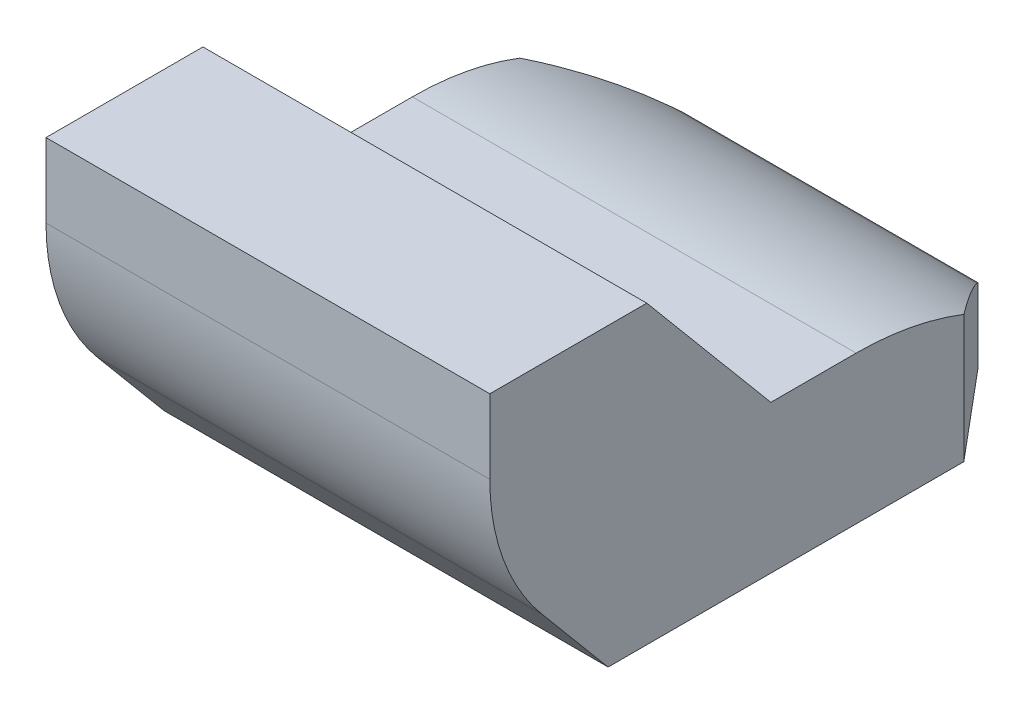
ISO-10303-21;
HEADER;
FILE_DESCRIPTION(('STEP AP214'),'2;1');
FILE_NAME('part.step','',(''),(''),'','','');
FILE_SCHEMA(('AUTOMOTIVE_DESIGN { 1 0 10303 214 1 1 1 1 }'));
ENDSEC;
DATA;
#1=APPLICATION_CONTEXT('core data for automotive mechanical design processes');
#2=APPLICATION_PROTOCOL_DEFINITION('international standard','automotive_design',2000,#1);
#3=PRODUCT_CONTEXT('',#1,'mechanical');
#4=PRODUCT('Part','Part','',(#3));
#5=PRODUCT_RELATED_PRODUCT_CATEGORY('part','',(#4));
#6=PRODUCT_DEFINITION_FORMATION('','',#4);
#7=PRODUCT_DEFINITION_CONTEXT('part definition',#1,'design');
#8=PRODUCT_DEFINITION('design','',#6,#7);
#9=PRODUCT_DEFINITION_SHAPE('','',#8);
#10=(LENGTH_UNIT() NAMED_UNIT(*) SI_UNIT(.MILLI.,.METRE.));
#11=(NAMED_UNIT(*) PLANE_ANGLE_UNIT() SI_UNIT($,.RADIAN.));
#12=(NAMED_UNIT(*) SI_UNIT($,.STERADIAN.) SOLID_ANGLE_UNIT());
#13=UNCERTAINTY_MEASURE_WITH_UNIT(LENGTH_MEASURE(1.E-05),#10,'distance_accuracy_value','');
#14=(GEOMETRIC_REPRESENTATION_CONTEXT(3) GLOBAL_UNCERTAINTY_ASSIGNED_CONTEXT((#13)) GLOBAL_UNIT_ASSIGNED_CONTEXT((#10,
#11,#12)) REPRESENTATION_CONTEXT('',''));
#15=CARTESIAN_POINT('',(0.,0.,0.));
#16=DIRECTION('',(0.,0.,1.));
#17=DIRECTION('',(1.,0.,0.));
#18=AXIS2_PLACEMENT_3D('',#15,#16,#17);
#19=CARTESIAN_POINT('',(-1.5,1.,-1.));
#20=DIRECTION('',(1.,0.,0.));
#21=DIRECTION('',(0.,0.,-1.));
#22=AXIS2_PLACEMENT_3D('',#19,#20,#21);
#23=PLANE('',#22);
#24=DIRECTION('',(0.,-0.766044443118977,-0.64278760968654));
#25=VECTOR('',#24,1.);
#26=CARTESIAN_POINT('',(-1.5,0.953402874075368,2.8));
#27=LINE('',#26,#25);
#28=CARTESIAN_POINT('',(-1.5,0.,2.));
#29=VERTEX_POINT('',#28);
#30=CARTESIAN_POINT('',(-1.5,0.535176810944862,2.44906666467847));
#31=VERTEX_POINT('',#30);
#32=EDGE_CURVE('E215',#29,#31,#27,.F.);
#33=ORIENTED_EDGE('',*,*,#32,.T.);
#34=CARTESIAN_POINT('',(-1.5,1.49935822547467,1.3));
#35=DIRECTION('',(1.,0.,0.));
#36=DIRECTION('',(0.,0.,-1.));
#37=AXIS2_PLACEMENT_3D('',#34,#35,#36);
#38=CIRCLE('',#37,1.5);
#39=CARTESIAN_POINT('',(-1.5,1.49935822547467,2.8));
#40=VERTEX_POINT('',#39);
#41=EDGE_CURVE('E12',#31,#40,#38,.F.);
#42=ORIENTED_EDGE('',*,*,#41,.T.);
#43=DIRECTION('',(0.,-1.,0.));
#44=VECTOR('',#43,1.);
#45=CARTESIAN_POINT('',(-1.5,1.,2.8));
#46=LINE('',#45,#44);
#47=CARTESIAN_POINT('',(-1.5,2.,2.8));
#48=VERTEX_POINT('',#47);
#49=EDGE_CURVE('E135',#48,#40,#46,.T.);
#50=ORIENTED_EDGE('',*,*,#49,.F.);
#51=DIRECTION('',(0.,0.,1.));
#52=VECTOR('',#51,1.);
#53=CARTESIAN_POINT('',(-1.5,2.,2.8));
#54=LINE('',#53,#52);
#55=CARTESIAN_POINT('',(-1.5,2.,1.73909963117726));
#56=VERTEX_POINT('',#55);
#57=EDGE_CURVE('E134',#56,#48,#54,.T.);
#58=ORIENTED_EDGE('',*,*,#57,.F.);
#59=DIRECTION('',(0.,-0.766044443118981,-0.642787609686536));
#60=VECTOR('',#59,1.);
#61=CARTESIAN_POINT('',(-1.5,0.0644326346384075,0.114965768783588));
#62=LINE('',#61,#60);
#63=CARTESIAN_POINT('',(-1.5,1.,0.899999999999992));
#64=VERTEX_POINT('',#63);
#65=EDGE_CURVE('E216',#56,#64,#62,.T.);
#66=ORIENTED_EDGE('',*,*,#65,.T.);
#67=DIRECTION('',(0.,0.,1.));
#68=VECTOR('',#67,1.);
#69=CARTESIAN_POINT('',(-1.5,1.,-1.));
#70=LINE('',#69,#68);
#71=CARTESIAN_POINT('',(-1.5,1.,0.323817264829512));
#72=VERTEX_POINT('',#71);
#73=EDGE_CURVE('E161',#72,#64,#70,.T.);
#74=ORIENTED_EDGE('',*,*,#73,.F.);
#75=CARTESIAN_POINT('',(-1.5,-1.,0.323817264829513));
#76=DIRECTION('',(1.,0.,0.));
#77=DIRECTION('',(0.,0.,-1.));
#78=AXIS2_PLACEMENT_3D('',#75,#76,#77);
#79=CIRCLE('',#78,2.);
#80=CARTESIAN_POINT('',(-1.5,0.862821160034645,-0.404123203702895));
#81=VERTEX_POINT('',#80);
#82=EDGE_CURVE('E200',#72,#81,#79,.F.);
#83=ORIENTED_EDGE('',*,*,#82,.T.);
#84=DIRECTION('',(0.,-1.,0.));
#85=VECTOR('',#84,1.);
#86=CARTESIAN_POINT('',(-1.5,1.,-0.404123203702895));
#87=LINE('',#86,#85);
#88=CARTESIAN_POINT('',(-1.5,0.,-0.404123203702895));
#89=VERTEX_POINT('',#88);
#90=EDGE_CURVE('E188',#81,#89,#87,.T.);
#91=ORIENTED_EDGE('',*,*,#90,.T.);
#92=DIRECTION('',(0.,0.,1.));
#93=VECTOR('',#92,1.);
#94=CARTESIAN_POINT('',(-1.5,0.,-1.));
#95=LINE('',#94,#93);
#96=EDGE_CURVE('E162',#89,#29,#95,.T.);
#97=ORIENTED_EDGE('',*,*,#96,.T.);
#98=EDGE_LOOP('',(#33,#42,#50,#58,#66,#74,#83,#91,#97));
#99=FACE_BOUND('',#98,.T.);
#100=ADVANCED_FACE('F44',(#99),#23,.F.);
#101=CARTESIAN_POINT('',(-1.5,1.,2.8));
#102=DIRECTION('',(0.,0.,-1.));
#103=DIRECTION('',(-1.,0.,0.));
#104=AXIS2_PLACEMENT_3D('',#101,#102,#103);
#105=PLANE('',#104);
#106=ORIENTED_EDGE('',*,*,#49,.T.);
#107=DIRECTION('',(-1.,0.,0.));
#108=VECTOR('',#107,1.);
#109=CARTESIAN_POINT('',(1.5,1.49935822547467,2.8));
#110=LINE('',#109,#108);
#111=CARTESIAN_POINT('',(1.5,1.49935822547467,2.8));
#112=VERTEX_POINT('',#111);
#113=EDGE_CURVE('E224',#40,#112,#110,.F.);
#114=ORIENTED_EDGE('',*,*,#113,.T.);
#115=DIRECTION('',(0.,-1.,0.));
#116=VECTOR('',#115,1.);
#117=CARTESIAN_POINT('',(1.5,1.,2.8));
#118=LINE('',#117,#116);
#119=CARTESIAN_POINT('',(1.5,2.,2.8));
#120=VERTEX_POINT('',#119);
#121=EDGE_CURVE('E145',#120,#112,#118,.T.);
#122=ORIENTED_EDGE('',*,*,#121,.F.);
#123=DIRECTION('',(1.,0.,0.));
#124=VECTOR('',#123,1.);
#125=CARTESIAN_POINT('',(-1.5,2.,2.8));
#126=LINE('',#125,#124);
#127=EDGE_CURVE('E143',#48,#120,#126,.T.);
#128=ORIENTED_EDGE('',*,*,#127,.F.);
#129=EDGE_LOOP('',(#106,#114,#122,#128));
#130=FACE_BOUND('',#129,.T.);
#131=ADVANCED_FACE('F147',(#130),#105,.F.);
#132=CARTESIAN_POINT('',(1.5,1.,-1.));
#133=DIRECTION('',(-1.,0.,0.));
#134=DIRECTION('',(0.,0.,1.));
#135=AXIS2_PLACEMENT_3D('',#132,#133,#134);
#136=PLANE('',#135);
#137=ORIENTED_EDGE('',*,*,#121,.T.);
#138=CARTESIAN_POINT('',(1.5,1.49935822547467,1.3));
#139=DIRECTION('',(-1.,0.,0.));
#140=DIRECTION('',(0.,0.,1.));
#141=AXIS2_PLACEMENT_3D('',#138,#139,#140);
#142=CIRCLE('',#141,1.5);
#143=CARTESIAN_POINT('',(1.5,0.535176810944862,2.44906666467847));
#144=VERTEX_POINT('',#143);
#145=EDGE_CURVE('E70',#112,#144,#142,.F.);
#146=ORIENTED_EDGE('',*,*,#145,.T.);
#147=DIRECTION('',(0.,0.766044443118977,0.64278760968654));
#148=VECTOR('',#147,1.);
#149=CARTESIAN_POINT('',(1.5,0.953402874075367,2.8));
#150=LINE('',#149,#148);
#151=CARTESIAN_POINT('',(1.5,0.,2.));
#152=VERTEX_POINT('',#151);
#153=EDGE_CURVE('E206',#144,#152,#150,.F.);
#154=ORIENTED_EDGE('',*,*,#153,.T.);
#155=DIRECTION('',(0.,0.,-1.));
#156=VECTOR('',#155,1.);
#157=CARTESIAN_POINT('',(1.5,0.,-1.));
#158=LINE('',#157,#156);
#159=CARTESIAN_POINT('',(1.5,0.,-0.404123203702895));
#160=VERTEX_POINT('',#159);
#161=EDGE_CURVE('E171',#152,#160,#158,.T.);
#162=ORIENTED_EDGE('',*,*,#161,.T.);
#163=DIRECTION('',(0.,1.,0.));
#164=VECTOR('',#163,1.);
#165=CARTESIAN_POINT('',(1.5,1.,-0.404123203702895));
#166=LINE('',#165,#164);
#167=CARTESIAN_POINT('',(1.5,0.862821160034645,-0.404123203702895));
#168=VERTEX_POINT('',#167);
#169=EDGE_CURVE('E190',#160,#168,#166,.T.);
#170=ORIENTED_EDGE('',*,*,#169,.T.);
#171=CARTESIAN_POINT('',(1.5,-1.,0.323817264829513));
#172=DIRECTION('',(-1.,0.,0.));
#173=DIRECTION('',(0.,0.,1.));
#174=AXIS2_PLACEMENT_3D('',#171,#172,#173);
#175=CIRCLE('',#174,2.);
#176=CARTESIAN_POINT('',(1.5,1.,0.323817264829512));
#177=VERTEX_POINT('',#176);
#178=EDGE_CURVE('E203',#168,#177,#175,.F.);
#179=ORIENTED_EDGE('',*,*,#178,.T.);
#180=DIRECTION('',(0.,0.,-1.));
#181=VECTOR('',#180,1.);
#182=CARTESIAN_POINT('',(1.5,1.,-1.));
#183=LINE('',#182,#181);
#184=CARTESIAN_POINT('',(1.5,1.,0.899999999999992));
#185=VERTEX_POINT('',#184);
#186=EDGE_CURVE('E168',#185,#177,#183,.T.);
#187=ORIENTED_EDGE('',*,*,#186,.F.);
#188=DIRECTION('',(0.,0.766044443118981,0.642787609686536));
#189=VECTOR('',#188,1.);
#190=CARTESIAN_POINT('',(1.5,0.0644326346384075,0.114965768783588));
#191=LINE('',#190,#189);
#192=CARTESIAN_POINT('',(1.5,2.,1.73909963117726));
#193=VERTEX_POINT('',#192);
#194=EDGE_CURVE('E219',#185,#193,#191,.T.);
#195=ORIENTED_EDGE('',*,*,#194,.T.);
#196=DIRECTION('',(0.,0.,-1.));
#197=VECTOR('',#196,1.);
#198=CARTESIAN_POINT('',(1.5,2.,2.8));
#199=LINE('',#198,#197);
#200=EDGE_CURVE('E146',#120,#193,#199,.T.);
#201=ORIENTED_EDGE('',*,*,#200,.F.);
#202=EDGE_LOOP('',(#137,#146,#154,#162,#170,#179,#187,#195,#201));
#203=FACE_BOUND('',#202,.T.);
#204=ADVANCED_FACE('F228',(#203),#136,.F.);
#205=CARTESIAN_POINT('',(-1.5,1.,-1.));
#206=DIRECTION('',(0.,0.,1.));
#207=DIRECTION('',(1.,0.,0.));
#208=AXIS2_PLACEMENT_3D('',#205,#206,#207);
#209=PLANE('',#208);
#210=DIRECTION('',(1.,0.,0.));
#211=VECTOR('',#210,1.);
#212=CARTESIAN_POINT('',(1.5,0.499999999999998,-1.));
#213=LINE('',#212,#211);
#214=CARTESIAN_POINT('',(-0.999999999999998,0.499999999999998,-1.));
#215=VERTEX_POINT('',#214);
#216=CARTESIAN_POINT('',(0.999999999999998,0.499999999999998,-1.));
#217=VERTEX_POINT('',#216);
#218=EDGE_CURVE('E180',#215,#217,#213,.T.);
#219=ORIENTED_EDGE('',*,*,#218,.T.);
#220=DIRECTION('',(0.,-1.,0.));
#221=VECTOR('',#220,1.);
#222=CARTESIAN_POINT('',(0.999999999999998,1.,-1.));
#223=LINE('',#222,#221);
#224=CARTESIAN_POINT('',(0.999999999999998,0.,-1.));
#225=VERTEX_POINT('',#224);
#226=EDGE_CURVE('E177',#217,#225,#223,.T.);
#227=ORIENTED_EDGE('',*,*,#226,.T.);
#228=DIRECTION('',(-1.,0.,0.));
#229=VECTOR('',#228,1.);
#230=CARTESIAN_POINT('',(-1.5,0.,-1.));
#231=LINE('',#230,#229);
#232=CARTESIAN_POINT('',(-0.999999999999998,0.,-1.));
#233=VERTEX_POINT('',#232);
#234=EDGE_CURVE('E170',#225,#233,#231,.T.);
#235=ORIENTED_EDGE('',*,*,#234,.T.);
#236=DIRECTION('',(0.,1.,0.));
#237=VECTOR('',#236,1.);
#238=CARTESIAN_POINT('',(-0.999999999999998,1.,-1.));
#239=LINE('',#238,#237);
#240=EDGE_CURVE('E142',#233,#215,#239,.T.);
#241=ORIENTED_EDGE('',*,*,#240,.T.);
#242=EDGE_LOOP('',(#219,#227,#235,#241));
#243=FACE_BOUND('',#242,.T.);
#244=ADVANCED_FACE('F254',(#243),#209,.F.);
#245=CARTESIAN_POINT('',(0.,1.,0.));
#246=DIRECTION('',(0.,1.,0.));
#247=DIRECTION('',(0.,0.,1.));
#248=AXIS2_PLACEMENT_3D('',#245,#246,#247);
#249=PLANE('',#248);
#250=ORIENTED_EDGE('',*,*,#73,.T.);
#251=DIRECTION('',(1.,0.,0.));
#252=VECTOR('',#251,1.);
#253=CARTESIAN_POINT('',(0.,1.,0.899999999999992));
#254=LINE('',#253,#252);
#255=EDGE_CURVE('E211',#64,#185,#254,.T.);
#256=ORIENTED_EDGE('',*,*,#255,.T.);
#257=ORIENTED_EDGE('',*,*,#186,.T.);
#258=DIRECTION('',(-1.,0.,0.));
#259=VECTOR('',#258,1.);
#260=CARTESIAN_POINT('',(0.,1.,0.323817264829513));
#261=LINE('',#260,#259);
#262=EDGE_CURVE('E195',#177,#72,#261,.T.);
#263=ORIENTED_EDGE('',*,*,#262,.T.);
#264=EDGE_LOOP('',(#250,#256,#257,#263));
#265=FACE_BOUND('',#264,.T.);
#266=ADVANCED_FACE('F231',(#265),#249,.T.);
#267=CARTESIAN_POINT('',(0.,0.,0.));
#268=DIRECTION('',(0.,1.,0.));
#269=DIRECTION('',(0.,0.,1.));
#270=AXIS2_PLACEMENT_3D('',#267,#268,#269);
#271=PLANE('',#270);
#272=ORIENTED_EDGE('',*,*,#161,.F.);
#273=DIRECTION('',(-1.,0.,0.));
#274=VECTOR('',#273,1.);
#275=CARTESIAN_POINT('',(0.,0.,2.));
#276=LINE('',#275,#274);
#277=EDGE_CURVE('E208',#152,#29,#276,.T.);
#278=ORIENTED_EDGE('',*,*,#277,.T.);
#279=ORIENTED_EDGE('',*,*,#96,.F.);
#280=DIRECTION('',(-0.642787609686541,0.,0.766044443118977));
#281=VECTOR('',#280,1.);
#282=CARTESIAN_POINT('',(-1.5,0.,-0.404123203702895));
#283=LINE('',#282,#281);
#284=EDGE_CURVE('E185',#89,#233,#283,.F.);
#285=ORIENTED_EDGE('',*,*,#284,.T.);
#286=ORIENTED_EDGE('',*,*,#234,.F.);
#287=DIRECTION('',(-0.642787609686541,0.,-0.766044443118977));
#288=VECTOR('',#287,1.);
#289=CARTESIAN_POINT('',(0.999999999999998,0.,-1.));
#290=LINE('',#289,#288);
#291=EDGE_CURVE('E183',#225,#160,#290,.F.);
#292=ORIENTED_EDGE('',*,*,#291,.T.);
#293=EDGE_LOOP('',(#272,#278,#279,#285,#286,#292));
#294=FACE_BOUND('',#293,.T.);
#295=ADVANCED_FACE('F252',(#294),#271,.F.);
#296=CARTESIAN_POINT('',(0.,2.,0.));
#297=DIRECTION('',(0.,-1.,0.));
#298=DIRECTION('',(0.,0.,-1.));
#299=AXIS2_PLACEMENT_3D('',#296,#297,#298);
#300=PLANE('',#299);
#301=ORIENTED_EDGE('',*,*,#57,.T.);
#302=ORIENTED_EDGE('',*,*,#127,.T.);
#303=ORIENTED_EDGE('',*,*,#200,.T.);
#304=DIRECTION('',(-1.,0.,0.));
#305=VECTOR('',#304,1.);
#306=CARTESIAN_POINT('',(0.,2.,1.73909963117726));
#307=LINE('',#306,#305);
#308=EDGE_CURVE('E151',#193,#56,#307,.T.);
#309=ORIENTED_EDGE('',*,*,#308,.T.);
#310=EDGE_LOOP('',(#301,#302,#303,#309));
#311=FACE_BOUND('',#310,.T.);
#312=ADVANCED_FACE('F153',(#311),#300,.F.);
#313=CARTESIAN_POINT('',(-1.5,1.,-0.404123203702895));
#314=DIRECTION('',(0.766044443118977,0.,0.642787609686541));
#315=DIRECTION('',(0.,-1.,0.));
#316=AXIS2_PLACEMENT_3D('',#313,#314,#315);
#317=PLANE('',#316);
#318=ORIENTED_EDGE('',*,*,#90,.F.);
#319=CARTESIAN_POINT('',(-2.11081457866456,-1.,0.323817264829513));
#320=DIRECTION('',(0.766044443118977,0.,0.642787609686541));
#321=DIRECTION('',(-0.642787609686541,0.,0.766044443118977));
#322=AXIS2_PLACEMENT_3D('',#319,#320,#321);
#323=ELLIPSE('',#322,2.61081457866456,2.);
#324=CARTESIAN_POINT('',(-1.03208888623795,0.532088886237954,-0.961757954543569));
#325=VERTEX_POINT('',#324);
#326=EDGE_CURVE('E197',#81,#325,#323,.F.);
#327=ORIENTED_EDGE('',*,*,#326,.T.);
#328=DIRECTION('',(-0.540716203060938,0.540716203060938,0.64440047757177));
#329=VECTOR('',#328,1.);
#330=CARTESIAN_POINT('',(-1.5,1.,-0.404123203702895));
#331=LINE('',#330,#329);
#332=EDGE_CURVE('E154',#215,#325,#331,.T.);
#333=ORIENTED_EDGE('',*,*,#332,.F.);
#334=ORIENTED_EDGE('',*,*,#240,.F.);
#335=ORIENTED_EDGE('',*,*,#284,.F.);
#336=EDGE_LOOP('',(#318,#327,#333,#334,#335));
#337=FACE_BOUND('',#336,.T.);
#338=ADVANCED_FACE('F244',(#337),#317,.F.);
#339=CARTESIAN_POINT('',(0.,1.,-0.404123203702895));
#340=DIRECTION('',(0.,0.766044443118977,-0.642787609686541));
#341=DIRECTION('',(1.,0.,0.));
#342=AXIS2_PLACEMENT_3D('',#339,#340,#341);
#343=PLANE('',#342);
#344=ORIENTED_EDGE('',*,*,#332,.T.);
#345=DIRECTION('',(-1.,0.,0.));
#346=VECTOR('',#345,1.);
#347=CARTESIAN_POINT('',(0.,0.532088886237954,-0.961757954543569));
#348=LINE('',#347,#346);
#349=CARTESIAN_POINT('',(1.03208888623795,0.532088886237954,-0.961757954543569));
#350=VERTEX_POINT('',#349);
#351=EDGE_CURVE('E202',#325,#350,#348,.F.);
#352=ORIENTED_EDGE('',*,*,#351,.T.);
#353=DIRECTION('',(0.540716203060938,0.540716203060938,0.64440047757177));
#354=VECTOR('',#353,1.);
#355=CARTESIAN_POINT('',(1.06143898162104,0.561438981621044,-0.926779872927789));
#356=LINE('',#355,#354);
#357=EDGE_CURVE('E159',#217,#350,#356,.T.);
#358=ORIENTED_EDGE('',*,*,#357,.F.);
#359=ORIENTED_EDGE('',*,*,#218,.F.);
#360=EDGE_LOOP('',(#344,#352,#358,#359));
#361=FACE_BOUND('',#360,.T.);
#362=ADVANCED_FACE('F276',(#361),#343,.T.);
#363=CARTESIAN_POINT('',(0.999999999999998,1.,-1.));
#364=DIRECTION('',(-0.766044443118977,0.,0.642787609686541));
#365=DIRECTION('',(0.,-1.,0.));
#366=AXIS2_PLACEMENT_3D('',#363,#364,#365);
#367=PLANE('',#366);
#368=ORIENTED_EDGE('',*,*,#357,.T.);
#369=CARTESIAN_POINT('',(2.11081457866456,-1.,0.323817264829513));
#370=DIRECTION('',(-0.766044443118977,0.,0.642787609686541));
#371=DIRECTION('',(-0.642787609686541,0.,-0.766044443118977));
#372=AXIS2_PLACEMENT_3D('',#369,#370,#371);
#373=ELLIPSE('',#372,2.61081457866456,2.);
#374=EDGE_CURVE('E204',#350,#168,#373,.F.);
#375=ORIENTED_EDGE('',*,*,#374,.T.);
#376=ORIENTED_EDGE('',*,*,#169,.F.);
#377=ORIENTED_EDGE('',*,*,#291,.F.);
#378=ORIENTED_EDGE('',*,*,#226,.F.);
#379=EDGE_LOOP('',(#368,#375,#376,#377,#378));
#380=FACE_BOUND('',#379,.T.);
#381=ADVANCED_FACE('F259',(#380),#367,.F.);
#382=CARTESIAN_POINT('',(0.,-1.,0.323817264829513));
#383=DIRECTION('',(-1.,0.,0.));
#384=DIRECTION('',(0.,0.,1.));
#385=AXIS2_PLACEMENT_3D('',#382,#383,#384);
#386=CYLINDRICAL_SURFACE('',#385,2.);
#387=ORIENTED_EDGE('',*,*,#374,.F.);
#388=ORIENTED_EDGE('',*,*,#351,.F.);
#389=ORIENTED_EDGE('',*,*,#326,.F.);
#390=ORIENTED_EDGE('',*,*,#82,.F.);
#391=ORIENTED_EDGE('',*,*,#262,.F.);
#392=ORIENTED_EDGE('',*,*,#178,.F.);
#393=EDGE_LOOP('',(#387,#388,#389,#390,#391,#392));
#394=FACE_BOUND('',#393,.T.);
#395=ADVANCED_FACE('F238',(#394),#386,.T.);
#396=CARTESIAN_POINT('',(-1.5,0.953402874075368,2.8));
#397=DIRECTION('',(0.,0.64278760968654,-0.766044443118977));
#398=DIRECTION('',(1.,0.,0.));
#399=AXIS2_PLACEMENT_3D('',#396,#397,#398);
#400=PLANE('',#399);
#401=ORIENTED_EDGE('',*,*,#153,.F.);
#402=DIRECTION('',(1.,0.,0.));
#403=VECTOR('',#402,1.);
#404=CARTESIAN_POINT('',(-1.5,0.535176810944862,2.44906666467847));
#405=LINE('',#404,#403);
#406=EDGE_CURVE('E52',#144,#31,#405,.F.);
#407=ORIENTED_EDGE('',*,*,#406,.T.);
#408=ORIENTED_EDGE('',*,*,#32,.F.);
#409=ORIENTED_EDGE('',*,*,#277,.F.);
#410=EDGE_LOOP('',(#401,#407,#408,#409));
#411=FACE_BOUND('',#410,.T.);
#412=ADVANCED_FACE('F263',(#411),#400,.F.);
#413=CARTESIAN_POINT('',(-1.5,2.07257823333481,1.8));
#414=DIRECTION('',(0.,-0.642787609686536,0.766044443118981));
#415=DIRECTION('',(-1.,0.,0.));
#416=AXIS2_PLACEMENT_3D('',#413,#414,#415);
#417=PLANE('',#416);
#418=ORIENTED_EDGE('',*,*,#194,.F.);
#419=ORIENTED_EDGE('',*,*,#255,.F.);
#420=ORIENTED_EDGE('',*,*,#65,.F.);
#421=ORIENTED_EDGE('',*,*,#308,.F.);
#422=EDGE_LOOP('',(#418,#419,#420,#421));
#423=FACE_BOUND('',#422,.T.);
#424=ADVANCED_FACE('F229',(#423),#417,.F.);
#425=CARTESIAN_POINT('',(-1.5,1.49935822547467,1.3));
#426=DIRECTION('',(1.,0.,0.));
#427=DIRECTION('',(0.,0.,-1.));
#428=AXIS2_PLACEMENT_3D('',#425,#426,#427);
#429=CYLINDRICAL_SURFACE('',#428,1.5);
#430=ORIENTED_EDGE('',*,*,#41,.F.);
#431=ORIENTED_EDGE('',*,*,#406,.F.);
#432=ORIENTED_EDGE('',*,*,#145,.F.);
#433=ORIENTED_EDGE('',*,*,#113,.F.);
#434=EDGE_LOOP('',(#430,#431,#432,#433));
#435=FACE_BOUND('',#434,.T.);
#436=ADVANCED_FACE('F50',(#435),#429,.T.);
#437=CLOSED_SHELL('',(#100,#131,#204,#244,#266,#295,#312,#338,#362,#381,#395,#412,#424,#436));
#438=MANIFOLD_SOLID_BREP('B2',#437);
#439=ADVANCED_BREP_SHAPE_REPRESENTATION('',(#18,#438),#14);
#440=SHAPE_DEFINITION_REPRESENTATION(#9,#439);
ENDSEC;
END-ISO-10303-21;
